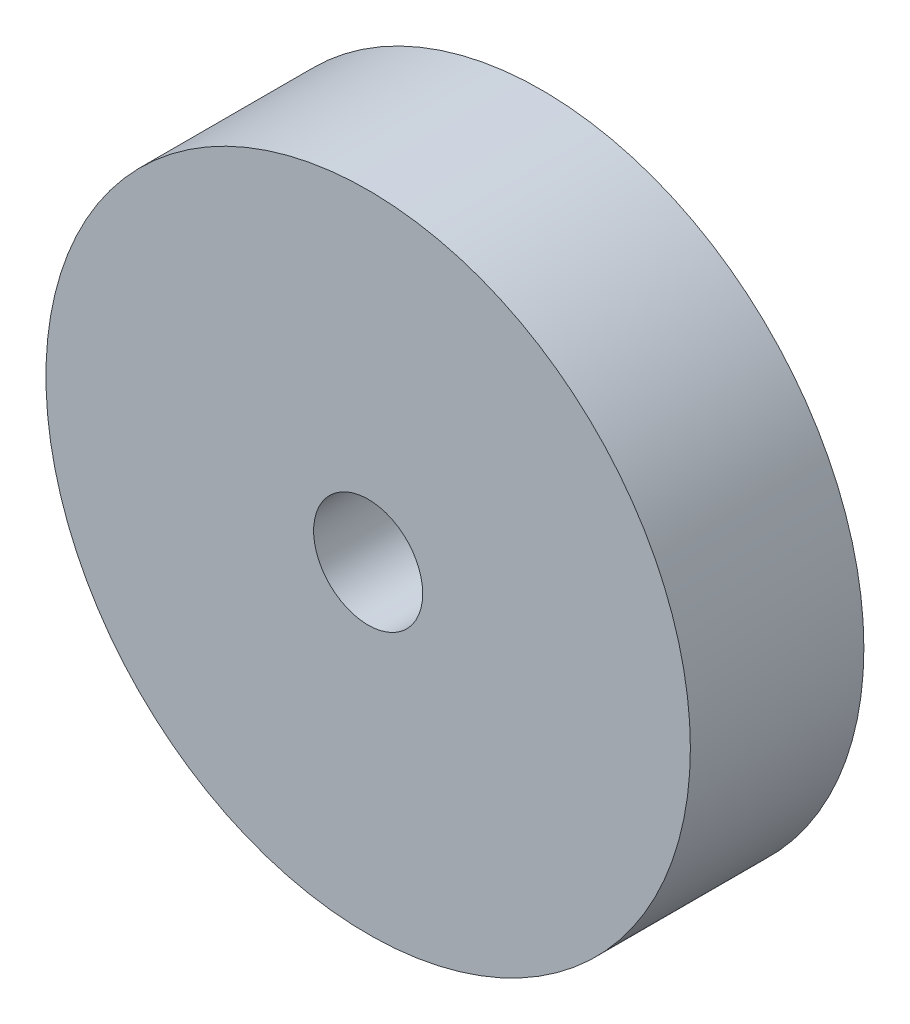
ISO-10303-21;
HEADER;
FILE_DESCRIPTION(('STEP AP214'),'2;1');
FILE_NAME('part.step','',(''),(''),'','','');
FILE_SCHEMA(('AUTOMOTIVE_DESIGN { 1 0 10303 214 1 1 1 1 }'));
ENDSEC;
DATA;
#1=APPLICATION_CONTEXT('core data for automotive mechanical design processes');
#2=APPLICATION_PROTOCOL_DEFINITION('international standard','automotive_design',2000,#1);
#3=PRODUCT_CONTEXT('',#1,'mechanical');
#4=PRODUCT('Part','Part','',(#3));
#5=PRODUCT_RELATED_PRODUCT_CATEGORY('part','',(#4));
#6=PRODUCT_DEFINITION_FORMATION('','',#4);
#7=PRODUCT_DEFINITION_CONTEXT('part definition',#1,'design');
#8=PRODUCT_DEFINITION('design','',#6,#7);
#9=PRODUCT_DEFINITION_SHAPE('','',#8);
#10=(LENGTH_UNIT() NAMED_UNIT(*) SI_UNIT(.MILLI.,.METRE.));
#11=(NAMED_UNIT(*) PLANE_ANGLE_UNIT() SI_UNIT($,.RADIAN.));
#12=(NAMED_UNIT(*) SI_UNIT($,.STERADIAN.) SOLID_ANGLE_UNIT());
#13=UNCERTAINTY_MEASURE_WITH_UNIT(LENGTH_MEASURE(1.E-05),#10,'distance_accuracy_value','');
#14=(GEOMETRIC_REPRESENTATION_CONTEXT(3) GLOBAL_UNCERTAINTY_ASSIGNED_CONTEXT((#13)) GLOBAL_UNIT_ASSIGNED_CONTEXT((#10,
#11,#12)) REPRESENTATION_CONTEXT('',''));
#15=CARTESIAN_POINT('',(0.,0.,0.));
#16=DIRECTION('',(0.,0.,1.));
#17=DIRECTION('',(1.,0.,0.));
#18=AXIS2_PLACEMENT_3D('',#15,#16,#17);
#19=CARTESIAN_POINT('',(-59.8968100808578,23.1083372225532,8.));
#20=DIRECTION('',(0.,0.,-1.));
#21=DIRECTION('',(-1.,0.,0.));
#22=AXIS2_PLACEMENT_3D('',#19,#20,#21);
#23=CYLINDRICAL_SURFACE('',#22,13.);
#24=CARTESIAN_POINT('',(-59.8968100808578,23.1083372225532,0.));
#25=DIRECTION('',(0.,0.,1.));
#26=DIRECTION('',(1.,0.,0.));
#27=AXIS2_PLACEMENT_3D('',#24,#25,#26);
#28=CIRCLE('',#27,13.);
#29=CARTESIAN_POINT('',(-46.8968100808578,23.1083372225532,0.));
#30=VERTEX_POINT('',#29);
#31=EDGE_CURVE('E10',#30,#30,#28,.T.);
#32=ORIENTED_EDGE('',*,*,#31,.T.);
#33=EDGE_LOOP('',(#32));
#34=FACE_BOUND('',#33,.T.);
#35=CARTESIAN_POINT('',(-59.8968100808578,23.1083372225532,7.));
#36=DIRECTION('',(0.,0.,1.));
#37=DIRECTION('',(1.,0.,0.));
#38=AXIS2_PLACEMENT_3D('',#35,#36,#37);
#39=CIRCLE('',#38,13.);
#40=CARTESIAN_POINT('',(-46.8968100808578,23.1083372225532,7.));
#41=VERTEX_POINT('',#40);
#42=EDGE_CURVE('E46',#41,#41,#39,.T.);
#43=ORIENTED_EDGE('',*,*,#42,.F.);
#44=EDGE_LOOP('',(#43));
#45=FACE_BOUND('',#44,.T.);
#46=ADVANCED_FACE('F34',(#34,#45),#23,.T.);
#47=CARTESIAN_POINT('',(-59.8968100808578,23.1083372225532,-2.));
#48=DIRECTION('',(0.,0.,1.));
#49=DIRECTION('',(1.,0.,0.));
#50=AXIS2_PLACEMENT_3D('',#47,#48,#49);
#51=CYLINDRICAL_SURFACE('',#50,2.2);
#52=CARTESIAN_POINT('',(-59.8968100808578,23.1083372225532,0.));
#53=DIRECTION('',(0.,0.,1.));
#54=DIRECTION('',(1.,0.,0.));
#55=AXIS2_PLACEMENT_3D('',#52,#53,#54);
#56=CIRCLE('',#55,2.2);
#57=CARTESIAN_POINT('',(-57.6968100808578,23.1083372225532,0.));
#58=VERTEX_POINT('',#57);
#59=EDGE_CURVE('E41',#58,#58,#56,.T.);
#60=ORIENTED_EDGE('',*,*,#59,.F.);
#61=EDGE_LOOP('',(#60));
#62=FACE_BOUND('',#61,.T.);
#63=CARTESIAN_POINT('',(-59.8968100808578,23.1083372225532,7.));
#64=DIRECTION('',(0.,0.,1.));
#65=DIRECTION('',(1.,0.,0.));
#66=AXIS2_PLACEMENT_3D('',#63,#64,#65);
#67=CIRCLE('',#66,2.2);
#68=CARTESIAN_POINT('',(-57.6968100808578,23.1083372225532,7.));
#69=VERTEX_POINT('',#68);
#70=EDGE_CURVE('E37',#69,#69,#67,.F.);
#71=ORIENTED_EDGE('',*,*,#70,.F.);
#72=EDGE_LOOP('',(#71));
#73=FACE_BOUND('',#72,.T.);
#74=ADVANCED_FACE('F56',(#62,#73),#51,.F.);
#75=CARTESIAN_POINT('',(-59.8968100808578,23.1083372225532,0.));
#76=DIRECTION('',(0.,0.,1.));
#77=DIRECTION('',(1.,0.,0.));
#78=AXIS2_PLACEMENT_3D('',#75,#76,#77);
#79=PLANE('',#78);
#80=ORIENTED_EDGE('',*,*,#59,.T.);
#81=EDGE_LOOP('',(#80));
#82=FACE_BOUND('',#81,.T.);
#83=ORIENTED_EDGE('',*,*,#31,.F.);
#84=EDGE_LOOP('',(#83));
#85=FACE_BOUND('',#84,.T.);
#86=ADVANCED_FACE('F58',(#82,#85),#79,.F.);
#87=CARTESIAN_POINT('',(0.,0.,7.));
#88=DIRECTION('',(0.,0.,1.));
#89=DIRECTION('',(1.,0.,0.));
#90=AXIS2_PLACEMENT_3D('',#87,#88,#89);
#91=PLANE('',#90);
#92=ORIENTED_EDGE('',*,*,#70,.T.);
#93=EDGE_LOOP('',(#92));
#94=FACE_BOUND('',#93,.T.);
#95=ORIENTED_EDGE('',*,*,#42,.T.);
#96=EDGE_LOOP('',(#95));
#97=FACE_BOUND('',#96,.T.);
#98=ADVANCED_FACE('F54',(#94,#97),#91,.T.);
#99=CLOSED_SHELL('',(#46,#74,#86,#98));
#100=MANIFOLD_SOLID_BREP('B2',#99);
#101=ADVANCED_BREP_SHAPE_REPRESENTATION('',(#18,#100),#14);
#102=SHAPE_DEFINITION_REPRESENTATION(#9,#101);
ENDSEC;
END-ISO-10303-21;
